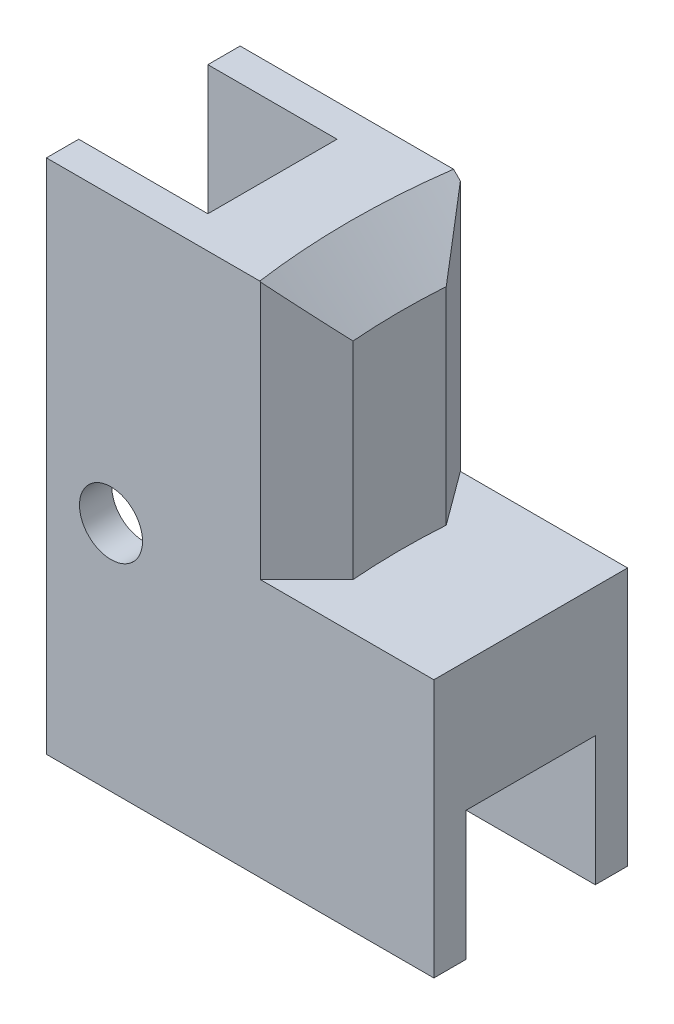
ISO-10303-21;
HEADER;
FILE_DESCRIPTION(('STEP AP214'),'2;1');
FILE_NAME('part.step','',(''),(''),'','','');
FILE_SCHEMA(('AUTOMOTIVE_DESIGN { 1 0 10303 214 1 1 1 1 }'));
ENDSEC;
DATA;
#1=APPLICATION_CONTEXT('core data for automotive mechanical design processes');
#2=APPLICATION_PROTOCOL_DEFINITION('international standard','automotive_design',2000,#1);
#3=PRODUCT_CONTEXT('',#1,'mechanical');
#4=PRODUCT('Part','Part','',(#3));
#5=PRODUCT_RELATED_PRODUCT_CATEGORY('part','',(#4));
#6=PRODUCT_DEFINITION_FORMATION('','',#4);
#7=PRODUCT_DEFINITION_CONTEXT('part definition',#1,'design');
#8=PRODUCT_DEFINITION('design','',#6,#7);
#9=PRODUCT_DEFINITION_SHAPE('','',#8);
#10=(LENGTH_UNIT() NAMED_UNIT(*) SI_UNIT(.MILLI.,.METRE.));
#11=(NAMED_UNIT(*) PLANE_ANGLE_UNIT() SI_UNIT($,.RADIAN.));
#12=(NAMED_UNIT(*) SI_UNIT($,.STERADIAN.) SOLID_ANGLE_UNIT());
#13=UNCERTAINTY_MEASURE_WITH_UNIT(LENGTH_MEASURE(1.E-05),#10,'distance_accuracy_value','');
#14=(GEOMETRIC_REPRESENTATION_CONTEXT(3) GLOBAL_UNCERTAINTY_ASSIGNED_CONTEXT((#13)) GLOBAL_UNIT_ASSIGNED_CONTEXT((#10,
#11,#12)) REPRESENTATION_CONTEXT('',''));
#15=CARTESIAN_POINT('',(0.,0.,0.));
#16=DIRECTION('',(0.,0.,1.));
#17=DIRECTION('',(1.,0.,0.));
#18=AXIS2_PLACEMENT_3D('',#15,#16,#17);
#19=CARTESIAN_POINT('',(-44.45,19.05,4.7625));
#20=DIRECTION('',(1.,0.,0.));
#21=DIRECTION('',(0.,0.,-1.));
#22=AXIS2_PLACEMENT_3D('',#19,#20,#21);
#23=PLANE('',#22);
#24=DIRECTION('',(0.,-1.,0.));
#25=VECTOR('',#24,1.);
#26=CARTESIAN_POINT('',(-44.45,-6.35,3.175));
#27=LINE('',#26,#25);
#28=CARTESIAN_POINT('',(-44.45,19.05,3.175));
#29=VERTEX_POINT('',#28);
#30=CARTESIAN_POINT('',(-44.45,-6.35,3.175));
#31=VERTEX_POINT('',#30);
#32=EDGE_CURVE('E242',#29,#31,#27,.T.);
#33=ORIENTED_EDGE('',*,*,#32,.T.);
#34=DIRECTION('',(0.,0.,-1.));
#35=VECTOR('',#34,1.);
#36=CARTESIAN_POINT('',(-44.45,-6.35,4.7625));
#37=LINE('',#36,#35);
#38=CARTESIAN_POINT('',(-44.45,-6.35,4.7625));
#39=VERTEX_POINT('',#38);
#40=EDGE_CURVE('E175',#39,#31,#37,.T.);
#41=ORIENTED_EDGE('',*,*,#40,.F.);
#42=DIRECTION('',(0.,-1.,0.));
#43=VECTOR('',#42,1.);
#44=CARTESIAN_POINT('',(-44.45,19.05,4.7625));
#45=LINE('',#44,#43);
#46=CARTESIAN_POINT('',(-44.45,19.05,4.7625));
#47=VERTEX_POINT('',#46);
#48=EDGE_CURVE('E291',#47,#39,#45,.T.);
#49=ORIENTED_EDGE('',*,*,#48,.F.);
#50=DIRECTION('',(0.,0.,-1.));
#51=VECTOR('',#50,1.);
#52=CARTESIAN_POINT('',(-44.45,19.05,4.7625));
#53=LINE('',#52,#51);
#54=EDGE_CURVE('E184',#47,#29,#53,.T.);
#55=ORIENTED_EDGE('',*,*,#54,.T.);
#56=EDGE_LOOP('',(#33,#41,#49,#55));
#57=FACE_BOUND('',#56,.T.);
#58=ADVANCED_FACE('F32',(#57),#23,.F.);
#59=CARTESIAN_POINT('',(-44.45,-6.35,4.7625));
#60=DIRECTION('',(0.,1.,0.));
#61=DIRECTION('',(-1.,0.,0.));
#62=AXIS2_PLACEMENT_3D('',#59,#60,#61);
#63=PLANE('',#62);
#64=DIRECTION('',(1.,0.,0.));
#65=VECTOR('',#64,1.);
#66=CARTESIAN_POINT('',(-25.4,-6.35,3.175));
#67=LINE('',#66,#65);
#68=CARTESIAN_POINT('',(-25.4,-6.35,3.175));
#69=VERTEX_POINT('',#68);
#70=EDGE_CURVE('E270',#31,#69,#67,.T.);
#71=ORIENTED_EDGE('',*,*,#70,.T.);
#72=DIRECTION('',(0.,0.,-1.));
#73=VECTOR('',#72,1.);
#74=CARTESIAN_POINT('',(-25.4,-6.35,4.7625));
#75=LINE('',#74,#73);
#76=CARTESIAN_POINT('',(-25.4,-6.35,4.7625));
#77=VERTEX_POINT('',#76);
#78=EDGE_CURVE('E176',#77,#69,#75,.T.);
#79=ORIENTED_EDGE('',*,*,#78,.F.);
#80=DIRECTION('',(1.,0.,0.));
#81=VECTOR('',#80,1.);
#82=CARTESIAN_POINT('',(-44.45,-6.35,4.7625));
#83=LINE('',#82,#81);
#84=EDGE_CURVE('E293',#39,#77,#83,.T.);
#85=ORIENTED_EDGE('',*,*,#84,.F.);
#86=ORIENTED_EDGE('',*,*,#40,.T.);
#87=EDGE_LOOP('',(#71,#79,#85,#86));
#88=FACE_BOUND('',#87,.T.);
#89=ADVANCED_FACE('F340',(#88),#63,.F.);
#90=CARTESIAN_POINT('',(-28.575,19.05,4.7625));
#91=DIRECTION('',(0.,-1.,0.));
#92=DIRECTION('',(1.,0.,0.));
#93=AXIS2_PLACEMENT_3D('',#90,#91,#92);
#94=PLANE('',#93);
#95=DIRECTION('',(-1.,0.,0.));
#96=VECTOR('',#95,1.);
#97=CARTESIAN_POINT('',(-28.575,19.05,4.7625));
#98=LINE('',#97,#96);
#99=CARTESIAN_POINT('',(-33.9576603103041,19.05,4.7625));
#100=VERTEX_POINT('',#99);
#101=EDGE_CURVE('E289',#100,#47,#98,.T.);
#102=ORIENTED_EDGE('',*,*,#101,.F.);
#103=CARTESIAN_POINT('',(0.,19.05,0.));
#104=DIRECTION('',(0.,-1.,0.));
#105=DIRECTION('',(1.,0.,0.));
#106=AXIS2_PLACEMENT_3D('',#103,#104,#105);
#107=CIRCLE('',#106,34.2900000000001);
#108=CARTESIAN_POINT('',(-33.9576603103041,19.05,-4.7625));
#109=VERTEX_POINT('',#108);
#110=EDGE_CURVE('E316',#100,#109,#107,.T.);
#111=ORIENTED_EDGE('',*,*,#110,.T.);
#112=DIRECTION('',(-1.,0.,0.));
#113=VECTOR('',#112,1.);
#114=CARTESIAN_POINT('',(-28.575,19.05,-4.7625));
#115=LINE('',#114,#113);
#116=CARTESIAN_POINT('',(-44.45,19.05,-4.7625));
#117=VERTEX_POINT('',#116);
#118=EDGE_CURVE('E286',#109,#117,#115,.T.);
#119=ORIENTED_EDGE('',*,*,#118,.T.);
#120=CARTESIAN_POINT('',(-44.45,19.05,-3.175));
#121=VERTEX_POINT('',#120);
#122=EDGE_CURVE('E179',#121,#117,#53,.T.);
#123=ORIENTED_EDGE('',*,*,#122,.F.);
#124=DIRECTION('',(-1.,0.,0.));
#125=VECTOR('',#124,1.);
#126=CARTESIAN_POINT('',(-44.45,19.05,-3.175));
#127=LINE('',#126,#125);
#128=CARTESIAN_POINT('',(-38.1,19.05,-3.175));
#129=VERTEX_POINT('',#128);
#130=EDGE_CURVE('E155',#129,#121,#127,.T.);
#131=ORIENTED_EDGE('',*,*,#130,.F.);
#132=DIRECTION('',(0.,0.,1.));
#133=VECTOR('',#132,1.);
#134=CARTESIAN_POINT('',(-38.1,19.05,-3.175));
#135=LINE('',#134,#133);
#136=CARTESIAN_POINT('',(-38.1,19.05,3.175));
#137=VERTEX_POINT('',#136);
#138=EDGE_CURVE('E283',#129,#137,#135,.T.);
#139=ORIENTED_EDGE('',*,*,#138,.T.);
#140=DIRECTION('',(-1.,0.,0.));
#141=VECTOR('',#140,1.);
#142=CARTESIAN_POINT('',(-44.45,19.05,3.175));
#143=LINE('',#142,#141);
#144=EDGE_CURVE('E160',#137,#29,#143,.T.);
#145=ORIENTED_EDGE('',*,*,#144,.T.);
#146=ORIENTED_EDGE('',*,*,#54,.F.);
#147=EDGE_LOOP('',(#102,#111,#119,#123,#131,#139,#145,#146));
#148=FACE_BOUND('',#147,.T.);
#149=ADVANCED_FACE('F342',(#148),#94,.F.);
#150=CARTESIAN_POINT('',(-44.45,-6.35,-3.175));
#151=VERTEX_POINT('',#150);
#152=CARTESIAN_POINT('',(-44.45,-6.35,-4.7625));
#153=VERTEX_POINT('',#152);
#154=EDGE_CURVE('E166',#151,#153,#37,.T.);
#155=ORIENTED_EDGE('',*,*,#154,.F.);
#156=DIRECTION('',(0.,-1.,0.));
#157=VECTOR('',#156,1.);
#158=CARTESIAN_POINT('',(-44.45,-6.35,-3.175));
#159=LINE('',#158,#157);
#160=EDGE_CURVE('E148',#121,#151,#159,.T.);
#161=ORIENTED_EDGE('',*,*,#160,.F.);
#162=ORIENTED_EDGE('',*,*,#122,.T.);
#163=DIRECTION('',(0.,-1.,0.));
#164=VECTOR('',#163,1.);
#165=CARTESIAN_POINT('',(-44.45,19.05,-4.7625));
#166=LINE('',#165,#164);
#167=EDGE_CURVE('E173',#117,#153,#166,.T.);
#168=ORIENTED_EDGE('',*,*,#167,.T.);
#169=EDGE_LOOP('',(#155,#161,#162,#168));
#170=FACE_BOUND('',#169,.T.);
#171=ADVANCED_FACE('F171',(#170),#23,.F.);
#172=CARTESIAN_POINT('',(-25.4,-6.35,-3.175));
#173=VERTEX_POINT('',#172);
#174=CARTESIAN_POINT('',(-25.4,-6.35,-4.7625));
#175=VERTEX_POINT('',#174);
#176=EDGE_CURVE('E168',#173,#175,#75,.T.);
#177=ORIENTED_EDGE('',*,*,#176,.F.);
#178=DIRECTION('',(1.,0.,0.));
#179=VECTOR('',#178,1.);
#180=CARTESIAN_POINT('',(-25.4,-6.35,-3.175));
#181=LINE('',#180,#179);
#182=EDGE_CURVE('E152',#151,#173,#181,.T.);
#183=ORIENTED_EDGE('',*,*,#182,.F.);
#184=ORIENTED_EDGE('',*,*,#154,.T.);
#185=DIRECTION('',(1.,0.,0.));
#186=VECTOR('',#185,1.);
#187=CARTESIAN_POINT('',(-44.45,-6.35,-4.7625));
#188=LINE('',#187,#186);
#189=EDGE_CURVE('E302',#153,#175,#188,.T.);
#190=ORIENTED_EDGE('',*,*,#189,.T.);
#191=EDGE_LOOP('',(#177,#183,#184,#190));
#192=FACE_BOUND('',#191,.T.);
#193=ADVANCED_FACE('F164',(#192),#63,.F.);
#194=CARTESIAN_POINT('',(-25.4,-6.35,4.7625));
#195=DIRECTION('',(-1.,0.,0.));
#196=DIRECTION('',(0.,-1.,0.));
#197=AXIS2_PLACEMENT_3D('',#194,#195,#196);
#198=PLANE('',#197);
#199=DIRECTION('',(0.,0.,1.));
#200=VECTOR('',#199,1.);
#201=CARTESIAN_POINT('',(-25.4,0.,-3.175));
#202=LINE('',#201,#200);
#203=CARTESIAN_POINT('',(-25.4,0.,-3.175));
#204=VERTEX_POINT('',#203);
#205=CARTESIAN_POINT('',(-25.4,0.,3.175));
#206=VERTEX_POINT('',#205);
#207=EDGE_CURVE('E267',#204,#206,#202,.T.);
#208=ORIENTED_EDGE('',*,*,#207,.F.);
#209=DIRECTION('',(0.,1.,0.));
#210=VECTOR('',#209,1.);
#211=CARTESIAN_POINT('',(-25.4,0.,-3.175));
#212=LINE('',#211,#210);
#213=EDGE_CURVE('E169',#173,#204,#212,.T.);
#214=ORIENTED_EDGE('',*,*,#213,.F.);
#215=ORIENTED_EDGE('',*,*,#176,.T.);
#216=DIRECTION('',(0.,1.,0.));
#217=VECTOR('',#216,1.);
#218=CARTESIAN_POINT('',(-25.4,-6.35,-4.7625));
#219=LINE('',#218,#217);
#220=CARTESIAN_POINT('',(-25.4,6.35,-4.7625));
#221=VERTEX_POINT('',#220);
#222=EDGE_CURVE('E304',#175,#221,#219,.T.);
#223=ORIENTED_EDGE('',*,*,#222,.T.);
#224=DIRECTION('',(0.,0.,-1.));
#225=VECTOR('',#224,1.);
#226=CARTESIAN_POINT('',(-25.4,6.35,4.7625));
#227=LINE('',#226,#225);
#228=CARTESIAN_POINT('',(-25.4,6.35,4.7625));
#229=VERTEX_POINT('',#228);
#230=EDGE_CURVE('E299',#229,#221,#227,.T.);
#231=ORIENTED_EDGE('',*,*,#230,.F.);
#232=DIRECTION('',(0.,1.,0.));
#233=VECTOR('',#232,1.);
#234=CARTESIAN_POINT('',(-25.4,-6.35,4.7625));
#235=LINE('',#234,#233);
#236=EDGE_CURVE('E295',#77,#229,#235,.T.);
#237=ORIENTED_EDGE('',*,*,#236,.F.);
#238=ORIENTED_EDGE('',*,*,#78,.T.);
#239=DIRECTION('',(0.,1.,0.));
#240=VECTOR('',#239,1.);
#241=CARTESIAN_POINT('',(-25.4,0.,3.175));
#242=LINE('',#241,#240);
#243=EDGE_CURVE('E273',#69,#206,#242,.T.);
#244=ORIENTED_EDGE('',*,*,#243,.T.);
#245=EDGE_LOOP('',(#208,#214,#215,#223,#231,#237,#238,#244));
#246=FACE_BOUND('',#245,.T.);
#247=ADVANCED_FACE('F310',(#246),#198,.F.);
#248=CARTESIAN_POINT('',(-25.4,6.35,4.7625));
#249=DIRECTION('',(0.,-1.,0.));
#250=DIRECTION('',(0.,0.,-1.));
#251=AXIS2_PLACEMENT_3D('',#248,#249,#250);
#252=PLANE('',#251);
#253=DIRECTION('',(-1.,0.,0.));
#254=VECTOR('',#253,1.);
#255=CARTESIAN_POINT('',(-25.4,6.35,-4.7625));
#256=LINE('',#255,#254);
#257=CARTESIAN_POINT('',(-33.6214216836475,6.35,-4.7625));
#258=VERTEX_POINT('',#257);
#259=EDGE_CURVE('E49',#221,#258,#256,.T.);
#260=ORIENTED_EDGE('',*,*,#259,.T.);
#261=DIRECTION('',(0.593040555527492,0.,0.805172589883463));
#262=VECTOR('',#261,1.);
#263=CARTESIAN_POINT('',(-26.181784015518,6.35,5.33831397167578));
#264=LINE('',#263,#262);
#265=CARTESIAN_POINT('',(-31.678807444753,6.34999999999999,-2.12500797134108));
#266=VERTEX_POINT('',#265);
#267=EDGE_CURVE('E11',#258,#266,#264,.T.);
#268=ORIENTED_EDGE('',*,*,#267,.T.);
#269=CARTESIAN_POINT('',(0.,6.34999999999999,0.));
#270=DIRECTION('',(0.,-1.,0.));
#271=DIRECTION('',(0.,0.,-1.));
#272=AXIS2_PLACEMENT_3D('',#269,#270,#271);
#273=CIRCLE('',#272,31.75);
#274=CARTESIAN_POINT('',(-31.6526522796179,6.34999999999999,2.48437188552766));
#275=VERTEX_POINT('',#274);
#276=EDGE_CURVE('E238',#266,#275,#273,.F.);
#277=ORIENTED_EDGE('',*,*,#276,.T.);
#278=DIRECTION('',(-0.707106781186549,0.,0.707106781186547));
#279=VECTOR('',#278,1.);
#280=CARTESIAN_POINT('',(-29.6653901970451,6.35,0.497109802954887));
#281=LINE('',#280,#279);
#282=CARTESIAN_POINT('',(-33.9307803940902,6.35,4.7625));
#283=VERTEX_POINT('',#282);
#284=EDGE_CURVE('E42',#275,#283,#281,.T.);
#285=ORIENTED_EDGE('',*,*,#284,.T.);
#286=DIRECTION('',(-1.,0.,0.));
#287=VECTOR('',#286,1.);
#288=CARTESIAN_POINT('',(-25.4,6.35,4.7625));
#289=LINE('',#288,#287);
#290=EDGE_CURVE('E297',#229,#283,#289,.T.);
#291=ORIENTED_EDGE('',*,*,#290,.F.);
#292=ORIENTED_EDGE('',*,*,#230,.T.);
#293=EDGE_LOOP('',(#260,#268,#277,#285,#291,#292));
#294=FACE_BOUND('',#293,.T.);
#295=ADVANCED_FACE('F320',(#294),#252,.F.);
#296=CARTESIAN_POINT('',(0.,0.,4.7625));
#297=DIRECTION('',(0.,0.,1.));
#298=DIRECTION('',(1.,0.,0.));
#299=AXIS2_PLACEMENT_3D('',#296,#297,#298);
#300=PLANE('',#299);
#301=CARTESIAN_POINT('',(-41.275,5.08,4.7625));
#302=DIRECTION('',(0.,0.,1.));
#303=DIRECTION('',(1.,0.,0.));
#304=AXIS2_PLACEMENT_3D('',#301,#302,#303);
#305=CIRCLE('',#304,1.55);
#306=CARTESIAN_POINT('',(-39.725,5.08,4.7625));
#307=VERTEX_POINT('',#306);
#308=EDGE_CURVE('E257',#307,#307,#305,.T.);
#309=ORIENTED_EDGE('',*,*,#308,.F.);
#310=EDGE_LOOP('',(#309));
#311=FACE_BOUND('',#310,.T.);
#312=ORIENTED_EDGE('',*,*,#290,.T.);
#313=DIRECTION('',(0.,1.,0.));
#314=VECTOR('',#313,1.);
#315=CARTESIAN_POINT('',(-33.9307803940902,19.05,4.7625));
#316=LINE('',#315,#314);
#317=CARTESIAN_POINT('',(-33.9307803940902,19.023380808116,4.7625));
#318=VERTEX_POINT('',#317);
#319=EDGE_CURVE('E210',#283,#318,#316,.T.);
#320=ORIENTED_EDGE('',*,*,#319,.T.);
#321=CARTESIAN_POINT('',(-33.9307803940902,19.023380808116,4.7625));
#322=CARTESIAN_POINT('',(-33.9352603970809,19.0278173229756,4.7625));
#323=CARTESIAN_POINT('',(-33.939740391594,19.0322538463958,4.7625));
#324=CARTESIAN_POINT('',(-33.9487003636653,19.0411269103571,4.7625));
#325=CARTESIAN_POINT('',(-33.9531803412235,19.0455634508983,4.7625));
#326=CARTESIAN_POINT('',(-33.9576603103041,19.05,4.7625));
#327=B_SPLINE_CURVE_WITH_KNOTS('',3,(#321,#322,#323,#324,#325,#326),.UNSPECIFIED.,.F.,.F.,(4,2,
4),(0.,0.0189150156768828,0.0378300313537609),.UNSPECIFIED.);
#328=EDGE_CURVE('E203',#318,#100,#327,.T.);
#329=ORIENTED_EDGE('',*,*,#328,.T.);
#330=ORIENTED_EDGE('',*,*,#101,.T.);
#331=ORIENTED_EDGE('',*,*,#48,.T.);
#332=ORIENTED_EDGE('',*,*,#84,.T.);
#333=ORIENTED_EDGE('',*,*,#236,.T.);
#334=EDGE_LOOP('',(#312,#320,#329,#330,#331,#332,#333));
#335=FACE_BOUND('',#334,.T.);
#336=ADVANCED_FACE('F212',(#311,#335),#300,.T.);
#337=CARTESIAN_POINT('',(0.,0.,-4.7625));
#338=DIRECTION('',(0.,0.,1.));
#339=DIRECTION('',(1.,0.,0.));
#340=AXIS2_PLACEMENT_3D('',#337,#338,#339);
#341=PLANE('',#340);
#342=CARTESIAN_POINT('',(-41.275,5.08,-4.7625));
#343=DIRECTION('',(0.,0.,1.));
#344=DIRECTION('',(1.,0.,0.));
#345=AXIS2_PLACEMENT_3D('',#342,#343,#344);
#346=CIRCLE('',#345,1.55);
#347=CARTESIAN_POINT('',(-39.725,5.08,-4.7625));
#348=VERTEX_POINT('',#347);
#349=EDGE_CURVE('E255',#348,#348,#346,.T.);
#350=ORIENTED_EDGE('',*,*,#349,.T.);
#351=EDGE_LOOP('',(#350));
#352=FACE_BOUND('',#351,.T.);
#353=DIRECTION('',(0.,-1.,0.));
#354=VECTOR('',#353,1.);
#355=CARTESIAN_POINT('',(-33.6214216836475,0.,-4.7625));
#356=LINE('',#355,#354);
#357=CARTESIAN_POINT('',(-33.6214216836475,18.7170523202418,-4.7625));
#358=VERTEX_POINT('',#357);
#359=EDGE_CURVE('E313',#358,#258,#356,.T.);
#360=ORIENTED_EDGE('',*,*,#359,.T.);
#361=ORIENTED_EDGE('',*,*,#259,.F.);
#362=ORIENTED_EDGE('',*,*,#222,.F.);
#363=ORIENTED_EDGE('',*,*,#189,.F.);
#364=ORIENTED_EDGE('',*,*,#167,.F.);
#365=ORIENTED_EDGE('',*,*,#118,.F.);
#366=CARTESIAN_POINT('',(-33.9576603103041,19.05,-4.7625));
#367=CARTESIAN_POINT('',(-33.9016232281389,18.9945060045181,-4.7625));
#368=CARTESIAN_POINT('',(-33.8455848015017,18.9390133667974,-4.7625));
#369=CARTESIAN_POINT('',(-33.7335052592828,18.828030806878,-4.7625));
#370=CARTESIAN_POINT('',(-33.6774641437012,18.7725408846793,-4.7625));
#371=CARTESIAN_POINT('',(-33.6214216836475,18.7170523202418,-4.7625));
#372=B_SPLINE_CURVE_WITH_KNOTS('',3,(#366,#367,#368,#369,#370,#371),.UNSPECIFIED.,.F.,.F.,(4,2,
4),(0.,0.23659594863524,0.473191897271836),.UNSPECIFIED.);
#373=EDGE_CURVE('E56',#109,#358,#372,.T.);
#374=ORIENTED_EDGE('',*,*,#373,.T.);
#375=EDGE_LOOP('',(#360,#361,#362,#363,#364,#365,#374));
#376=FACE_BOUND('',#375,.T.);
#377=ADVANCED_FACE('F312',(#352,#376),#341,.F.);
#378=CARTESIAN_POINT('',(-38.1,19.05,-3.175));
#379=DIRECTION('',(1.,0.,0.));
#380=DIRECTION('',(0.,0.,-1.));
#381=AXIS2_PLACEMENT_3D('',#378,#379,#380);
#382=PLANE('',#381);
#383=DIRECTION('',(0.,1.,0.));
#384=VECTOR('',#383,1.);
#385=CARTESIAN_POINT('',(-38.1,19.05,-3.175));
#386=LINE('',#385,#384);
#387=CARTESIAN_POINT('',(-38.1,3.30200000000001,-3.175));
#388=VERTEX_POINT('',#387);
#389=EDGE_CURVE('E264',#388,#129,#386,.T.);
#390=ORIENTED_EDGE('',*,*,#389,.F.);
#391=DIRECTION('',(0.,0.,1.));
#392=VECTOR('',#391,1.);
#393=CARTESIAN_POINT('',(-38.1,3.302,-3.175));
#394=LINE('',#393,#392);
#395=CARTESIAN_POINT('',(-38.1,3.30200000000001,3.175));
#396=VERTEX_POINT('',#395);
#397=EDGE_CURVE('E187',#388,#396,#394,.T.);
#398=ORIENTED_EDGE('',*,*,#397,.T.);
#399=DIRECTION('',(0.,1.,0.));
#400=VECTOR('',#399,1.);
#401=CARTESIAN_POINT('',(-38.1,19.05,3.175));
#402=LINE('',#401,#400);
#403=EDGE_CURVE('E279',#396,#137,#402,.T.);
#404=ORIENTED_EDGE('',*,*,#403,.T.);
#405=ORIENTED_EDGE('',*,*,#138,.F.);
#406=EDGE_LOOP('',(#390,#398,#404,#405));
#407=FACE_BOUND('',#406,.T.);
#408=ADVANCED_FACE('F332',(#407),#382,.F.);
#409=CARTESIAN_POINT('',(-38.1,0.,-3.175));
#410=DIRECTION('',(0.,1.,0.));
#411=DIRECTION('',(-1.,0.,0.));
#412=AXIS2_PLACEMENT_3D('',#409,#410,#411);
#413=PLANE('',#412);
#414=DIRECTION('',(-1.,0.,0.));
#415=VECTOR('',#414,1.);
#416=CARTESIAN_POINT('',(-38.1,0.,3.175));
#417=LINE('',#416,#415);
#418=CARTESIAN_POINT('',(-34.798,0.,3.175));
#419=VERTEX_POINT('',#418);
#420=EDGE_CURVE('E276',#206,#419,#417,.T.);
#421=ORIENTED_EDGE('',*,*,#420,.T.);
#422=DIRECTION('',(0.,0.,1.));
#423=VECTOR('',#422,1.);
#424=CARTESIAN_POINT('',(-34.798,0.,-3.175));
#425=LINE('',#424,#423);
#426=CARTESIAN_POINT('',(-34.798,0.,-3.175));
#427=VERTEX_POINT('',#426);
#428=EDGE_CURVE('E190',#419,#427,#425,.F.);
#429=ORIENTED_EDGE('',*,*,#428,.T.);
#430=DIRECTION('',(-1.,0.,0.));
#431=VECTOR('',#430,1.);
#432=CARTESIAN_POINT('',(-38.1,0.,-3.175));
#433=LINE('',#432,#431);
#434=EDGE_CURVE('E261',#204,#427,#433,.T.);
#435=ORIENTED_EDGE('',*,*,#434,.F.);
#436=ORIENTED_EDGE('',*,*,#207,.T.);
#437=EDGE_LOOP('',(#421,#429,#435,#436));
#438=FACE_BOUND('',#437,.T.);
#439=ADVANCED_FACE('F374',(#438),#413,.F.);
#440=CARTESIAN_POINT('',(0.,0.,-3.175));
#441=DIRECTION('',(0.,0.,-1.));
#442=DIRECTION('',(-1.,0.,0.));
#443=AXIS2_PLACEMENT_3D('',#440,#441,#442);
#444=PLANE('',#443);
#445=CARTESIAN_POINT('',(-41.275,5.08,-3.175));
#446=DIRECTION('',(0.,0.,-1.));
#447=DIRECTION('',(-1.,0.,0.));
#448=AXIS2_PLACEMENT_3D('',#445,#446,#447);
#449=CIRCLE('',#448,1.55);
#450=CARTESIAN_POINT('',(-39.725,5.08,-3.175));
#451=VERTEX_POINT('',#450);
#452=EDGE_CURVE('E245',#451,#451,#449,.T.);
#453=ORIENTED_EDGE('',*,*,#452,.T.);
#454=EDGE_LOOP('',(#453));
#455=FACE_BOUND('',#454,.T.);
#456=ORIENTED_EDGE('',*,*,#160,.T.);
#457=ORIENTED_EDGE('',*,*,#182,.T.);
#458=ORIENTED_EDGE('',*,*,#213,.T.);
#459=ORIENTED_EDGE('',*,*,#434,.T.);
#460=CARTESIAN_POINT('',(-34.798,3.302,-3.175));
#461=DIRECTION('',(0.,0.,-1.));
#462=DIRECTION('',(-1.,0.,0.));
#463=AXIS2_PLACEMENT_3D('',#460,#461,#462);
#464=CIRCLE('',#463,3.302);
#465=EDGE_CURVE('E194',#427,#388,#464,.T.);
#466=ORIENTED_EDGE('',*,*,#465,.T.);
#467=ORIENTED_EDGE('',*,*,#389,.T.);
#468=ORIENTED_EDGE('',*,*,#130,.T.);
#469=EDGE_LOOP('',(#456,#457,#458,#459,#466,#467,#468));
#470=FACE_BOUND('',#469,.T.);
#471=ADVANCED_FACE('F150',(#455,#470),#444,.F.);
#472=CARTESIAN_POINT('',(0.,0.,3.175));
#473=DIRECTION('',(0.,0.,-1.));
#474=DIRECTION('',(-1.,0.,0.));
#475=AXIS2_PLACEMENT_3D('',#472,#473,#474);
#476=PLANE('',#475);
#477=CARTESIAN_POINT('',(-41.275,5.08,3.175));
#478=DIRECTION('',(0.,0.,-1.));
#479=DIRECTION('',(-1.,0.,0.));
#480=AXIS2_PLACEMENT_3D('',#477,#478,#479);
#481=CIRCLE('',#480,1.55);
#482=CARTESIAN_POINT('',(-39.725,5.08,3.175));
#483=VERTEX_POINT('',#482);
#484=EDGE_CURVE('E37',#483,#483,#481,.T.);
#485=ORIENTED_EDGE('',*,*,#484,.F.);
#486=EDGE_LOOP('',(#485));
#487=FACE_BOUND('',#486,.T.);
#488=ORIENTED_EDGE('',*,*,#32,.F.);
#489=ORIENTED_EDGE('',*,*,#144,.F.);
#490=ORIENTED_EDGE('',*,*,#403,.F.);
#491=CARTESIAN_POINT('',(-34.798,3.302,3.175));
#492=DIRECTION('',(0.,0.,-1.));
#493=DIRECTION('',(-1.,0.,0.));
#494=AXIS2_PLACEMENT_3D('',#491,#492,#493);
#495=CIRCLE('',#494,3.302);
#496=EDGE_CURVE('E192',#396,#419,#495,.F.);
#497=ORIENTED_EDGE('',*,*,#496,.T.);
#498=ORIENTED_EDGE('',*,*,#420,.F.);
#499=ORIENTED_EDGE('',*,*,#243,.F.);
#500=ORIENTED_EDGE('',*,*,#70,.F.);
#501=EDGE_LOOP('',(#488,#489,#490,#497,#498,#499,#500));
#502=FACE_BOUND('',#501,.T.);
#503=ADVANCED_FACE('F366',(#487,#502),#476,.T.);
#504=CARTESIAN_POINT('',(-34.798,3.302,-3.175));
#505=DIRECTION('',(0.,0.,1.));
#506=DIRECTION('',(1.,0.,0.));
#507=AXIS2_PLACEMENT_3D('',#504,#505,#506);
#508=CYLINDRICAL_SURFACE('',#507,3.302);
#509=ORIENTED_EDGE('',*,*,#465,.F.);
#510=ORIENTED_EDGE('',*,*,#428,.F.);
#511=ORIENTED_EDGE('',*,*,#496,.F.);
#512=ORIENTED_EDGE('',*,*,#397,.F.);
#513=EDGE_LOOP('',(#509,#510,#511,#512));
#514=FACE_BOUND('',#513,.T.);
#515=ADVANCED_FACE('F222',(#514),#508,.T.);
#516=CARTESIAN_POINT('',(0.,-83.4525612106915,0.));
#517=DIRECTION('',(0.,1.,0.));
#518=DIRECTION('',(-1.,0.,0.));
#519=AXIS2_PLACEMENT_3D('',#516,#517,#518);
#520=CYLINDRICAL_SURFACE('',#519,31.75);
#521=CARTESIAN_POINT('',(0.,16.51,0.));
#522=DIRECTION('',(0.,-1.,0.));
#523=DIRECTION('',(1.,0.,0.));
#524=AXIS2_PLACEMENT_3D('',#521,#522,#523);
#525=CIRCLE('',#524,31.75);
#526=CARTESIAN_POINT('',(-31.678807444753,16.51,-2.12500797134108));
#527=VERTEX_POINT('',#526);
#528=CARTESIAN_POINT('',(-31.6526522796179,16.51,2.48437188552766));
#529=VERTEX_POINT('',#528);
#530=EDGE_CURVE('E196',#527,#529,#525,.F.);
#531=ORIENTED_EDGE('',*,*,#530,.T.);
#532=DIRECTION('',(0.,1.,0.));
#533=VECTOR('',#532,1.);
#534=CARTESIAN_POINT('',(-31.6526522796179,-83.4525612106915,2.48437188552766));
#535=LINE('',#534,#533);
#536=EDGE_CURVE('E200',#529,#275,#535,.F.);
#537=ORIENTED_EDGE('',*,*,#536,.T.);
#538=ORIENTED_EDGE('',*,*,#276,.F.);
#539=DIRECTION('',(0.,1.,0.));
#540=VECTOR('',#539,1.);
#541=CARTESIAN_POINT('',(-31.678807444753,-83.4525612106915,-2.12500797134108));
#542=LINE('',#541,#540);
#543=EDGE_CURVE('E198',#266,#527,#542,.T.);
#544=ORIENTED_EDGE('',*,*,#543,.T.);
#545=EDGE_LOOP('',(#531,#537,#538,#544));
#546=FACE_BOUND('',#545,.T.);
#547=ADVANCED_FACE('F323',(#546),#520,.F.);
#548=CARTESIAN_POINT('',(-33.6214216836475,-83.4525612106915,-4.7625));
#549=DIRECTION('',(0.805172589883463,0.,-0.593040555527492));
#550=DIRECTION('',(0.,1.,0.));
#551=AXIS2_PLACEMENT_3D('',#548,#549,#550);
#552=PLANE('',#551);
#553=ORIENTED_EDGE('',*,*,#267,.F.);
#554=ORIENTED_EDGE('',*,*,#359,.F.);
#555=CARTESIAN_POINT('',(-31.678807444753,16.51,-2.12500797134108));
#556=CARTESIAN_POINT('',(-31.8428186118604,16.6885510754049,-2.3476863277517));
#557=CARTESIAN_POINT('',(-32.0062611981724,16.8685826509612,-2.5695927206476));
#558=CARTESIAN_POINT('',(-32.3320537541385,17.2313838871709,-3.01192205817262));
#559=CARTESIAN_POINT('',(-32.4944038183681,17.414153306283,-3.23234513120721));
#560=CARTESIAN_POINT('',(-32.8180831801691,17.7822370651009,-3.67180537992719));
#561=CARTESIAN_POINT('',(-32.9794124868414,17.96755138207,-3.89084256796888));
#562=CARTESIAN_POINT('',(-33.3011202682093,18.3405631877581,-4.32762599718856));
#563=CARTESIAN_POINT('',(-33.4614986582718,18.5282608840662,-4.54537212346003));
#564=CARTESIAN_POINT('',(-33.6214216836475,18.7170523202418,-4.7625));
#565=B_SPLINE_CURVE_WITH_KNOTS('',3,(#555,#556,#557,#558,#559,#560,#561,#562,#563,#564),
.UNSPECIFIED.,.F.,.F.,(4,2,2,2,4),(0.,0.987560572830618,1.97503452715912,2.96249966490267,
3.9500514076395),.UNSPECIFIED.);
#566=EDGE_CURVE('E233',#527,#358,#565,.T.);
#567=ORIENTED_EDGE('',*,*,#566,.F.);
#568=ORIENTED_EDGE('',*,*,#543,.F.);
#569=EDGE_LOOP('',(#553,#554,#567,#568));
#570=FACE_BOUND('',#569,.T.);
#571=ADVANCED_FACE('F34',(#570),#552,.T.);
#572=CARTESIAN_POINT('',(0.,16.51,0.));
#573=DIRECTION('',(0.,1.,0.));
#574=DIRECTION('',(-1.,0.,0.));
#575=AXIS2_PLACEMENT_3D('',#572,#573,#574);
#576=CONICAL_SURFACE('',#575,31.75,0.785398163397452);
#577=ORIENTED_EDGE('',*,*,#110,.F.);
#578=ORIENTED_EDGE('',*,*,#328,.F.);
#579=CARTESIAN_POINT('',(-33.9307803940902,19.023380808116,4.7625));
#580=CARTESIAN_POINT('',(-33.7426197611455,18.8108954006391,4.5743393670553));
#581=CARTESIAN_POINT('',(-33.5540731150106,18.5990924600558,4.38579272092035));
#582=CARTESIAN_POINT('',(-33.1761618915087,18.1769706932847,4.00788149741841));
#583=CARTESIAN_POINT('',(-32.9867973432342,17.9666518149988,3.81851694914397));
#584=CARTESIAN_POINT('',(-32.6071903935126,17.5476015190773,3.43890999942233));
#585=CARTESIAN_POINT('',(-32.4169479886119,17.3388701076952,3.24866759452163));
#586=CARTESIAN_POINT('',(-32.0355203604371,16.9231178255799,2.86723996634688));
#587=CARTESIAN_POINT('',(-31.844335104129,16.7160970154696,2.67605471003877));
#588=CARTESIAN_POINT('',(-31.6526522796179,16.5099999999999,2.48437188552768));
#589=B_SPLINE_CURVE_WITH_KNOTS('',3,(#579,#580,#581,#582,#583,#584,#585,#586,#587,#588),
.UNSPECIFIED.,.F.,.F.,(4,2,2,2,4),(0.,1.02158207285164,2.04312810275649,3.06467815488651,
4.08626425633454),.UNSPECIFIED.);
#590=EDGE_CURVE('E228',#529,#318,#589,.F.);
#591=ORIENTED_EDGE('',*,*,#590,.F.);
#592=ORIENTED_EDGE('',*,*,#530,.F.);
#593=ORIENTED_EDGE('',*,*,#566,.T.);
#594=ORIENTED_EDGE('',*,*,#373,.F.);
#595=EDGE_LOOP('',(#577,#578,#591,#592,#593,#594));
#596=FACE_BOUND('',#595,.T.);
#597=ADVANCED_FACE('F216',(#596),#576,.F.);
#598=CARTESIAN_POINT('',(-31.6526522796179,-83.4525612106915,2.48437188552766));
#599=DIRECTION('',(0.707106781186547,0.,0.707106781186549));
#600=DIRECTION('',(0.,1.,0.));
#601=AXIS2_PLACEMENT_3D('',#598,#599,#600);
#602=PLANE('',#601);
#603=ORIENTED_EDGE('',*,*,#590,.T.);
#604=ORIENTED_EDGE('',*,*,#319,.F.);
#605=ORIENTED_EDGE('',*,*,#284,.F.);
#606=ORIENTED_EDGE('',*,*,#536,.F.);
#607=EDGE_LOOP('',(#603,#604,#605,#606));
#608=FACE_BOUND('',#607,.T.);
#609=ADVANCED_FACE('F220',(#608),#602,.T.);
#610=CARTESIAN_POINT('',(-41.275,5.08,-4.7625));
#611=DIRECTION('',(0.,0.,1.));
#612=DIRECTION('',(1.,0.,0.));
#613=AXIS2_PLACEMENT_3D('',#610,#611,#612);
#614=CYLINDRICAL_SURFACE('',#613,1.55);
#615=CARTESIAN_POINT('',(-39.725,5.08,3.175));
#616=CARTESIAN_POINT('',(-39.725,5.08,3.19153645833334));
#617=CARTESIAN_POINT('',(-39.725,5.08,3.20807291666667));
#618=CARTESIAN_POINT('',(-39.725,5.08,3.24114583333334));
#619=CARTESIAN_POINT('',(-39.725,5.08,3.25768229166667));
#620=CARTESIAN_POINT('',(-39.725,5.08,3.29075520833333));
#621=CARTESIAN_POINT('',(-39.725,5.08,3.30729166666667));
#622=CARTESIAN_POINT('',(-39.725,5.08,3.34036458333333));
#623=CARTESIAN_POINT('',(-39.725,5.08,3.35690104166667));
#624=CARTESIAN_POINT('',(-39.725,5.08,3.38997395833333));
#625=CARTESIAN_POINT('',(-39.725,5.08,3.40651041666667));
#626=CARTESIAN_POINT('',(-39.725,5.08,3.43958333333333));
#627=CARTESIAN_POINT('',(-39.725,5.08,3.45611979166667));
#628=CARTESIAN_POINT('',(-39.725,5.08,3.48919270833333));
#629=CARTESIAN_POINT('',(-39.725,5.08,3.50572916666667));
#630=CARTESIAN_POINT('',(-39.725,5.08,3.53880208333333));
#631=CARTESIAN_POINT('',(-39.725,5.08,3.55533854166667));
#632=CARTESIAN_POINT('',(-39.725,5.08,3.58841145833334));
#633=CARTESIAN_POINT('',(-39.725,5.08,3.60494791666667));
#634=CARTESIAN_POINT('',(-39.725,5.08,3.63802083333333));
#635=CARTESIAN_POINT('',(-39.725,5.08,3.65455729166667));
#636=CARTESIAN_POINT('',(-39.725,5.08,3.68763020833333));
#637=CARTESIAN_POINT('',(-39.725,5.08,3.70416666666667));
#638=CARTESIAN_POINT('',(-39.725,5.08,3.73723958333334));
#639=CARTESIAN_POINT('',(-39.725,5.08,3.75377604166667));
#640=CARTESIAN_POINT('',(-39.725,5.08,3.78684895833333));
#641=CARTESIAN_POINT('',(-39.725,5.08,3.80338541666667));
#642=CARTESIAN_POINT('',(-39.725,5.08,3.83645833333333));
#643=CARTESIAN_POINT('',(-39.725,5.08,3.85299479166667));
#644=CARTESIAN_POINT('',(-39.725,5.08,3.88606770833333));
#645=CARTESIAN_POINT('',(-39.725,5.08,3.90260416666667));
#646=CARTESIAN_POINT('',(-39.725,5.08,3.93567708333333));
#647=CARTESIAN_POINT('',(-39.725,5.08,3.95221354166667));
#648=CARTESIAN_POINT('',(-39.725,5.08,3.98528645833333));
#649=CARTESIAN_POINT('',(-39.725,5.08,4.00182291666667));
#650=CARTESIAN_POINT('',(-39.725,5.08,4.03489583333333));
#651=CARTESIAN_POINT('',(-39.725,5.08,4.05143229166667));
#652=CARTESIAN_POINT('',(-39.725,5.08,4.08450520833333));
#653=CARTESIAN_POINT('',(-39.725,5.08,4.10104166666667));
#654=CARTESIAN_POINT('',(-39.725,5.08,4.13411458333333));
#655=CARTESIAN_POINT('',(-39.725,5.08,4.15065104166667));
#656=CARTESIAN_POINT('',(-39.725,5.08,4.18372395833333));
#657=CARTESIAN_POINT('',(-39.725,5.08,4.20026041666667));
#658=CARTESIAN_POINT('',(-39.725,5.08,4.23333333333333));
#659=CARTESIAN_POINT('',(-39.725,5.08,4.24986979166667));
#660=CARTESIAN_POINT('',(-39.725,5.08,4.28294270833333));
#661=CARTESIAN_POINT('',(-39.725,5.08,4.29947916666667));
#662=CARTESIAN_POINT('',(-39.725,5.08,4.33255208333333));
#663=CARTESIAN_POINT('',(-39.725,5.08,4.34908854166667));
#664=CARTESIAN_POINT('',(-39.725,5.08,4.38216145833333));
#665=CARTESIAN_POINT('',(-39.725,5.08,4.39869791666667));
#666=CARTESIAN_POINT('',(-39.725,5.08,4.43177083333333));
#667=CARTESIAN_POINT('',(-39.725,5.08,4.44830729166667));
#668=CARTESIAN_POINT('',(-39.725,5.08,4.48138020833333));
#669=CARTESIAN_POINT('',(-39.725,5.08,4.49791666666667));
#670=CARTESIAN_POINT('',(-39.725,5.08,4.53098958333333));
#671=CARTESIAN_POINT('',(-39.725,5.08,4.54752604166667));
#672=CARTESIAN_POINT('',(-39.725,5.08,4.58059895833333));
#673=CARTESIAN_POINT('',(-39.725,5.08,4.59713541666667));
#674=CARTESIAN_POINT('',(-39.725,5.08,4.63020833333333));
#675=CARTESIAN_POINT('',(-39.725,5.08,4.64674479166667));
#676=CARTESIAN_POINT('',(-39.725,5.08,4.67981770833333));
#677=CARTESIAN_POINT('',(-39.725,5.08,4.69635416666667));
#678=CARTESIAN_POINT('',(-39.725,5.08,4.72942708333333));
#679=CARTESIAN_POINT('',(-39.725,5.08,4.74596354166667));
#680=CARTESIAN_POINT('',(-39.725,5.08,4.7625));
#681=B_SPLINE_CURVE_WITH_KNOTS('',3,(#615,#616,#617,#618,#619,#620,#621,#622,#623,#624,#625,
#626,#627,#628,#629,#630,#631,#632,#633,#634,#635,#636,#637,#638,#639,#640,#641,#642,#643,#644,
#645,#646,#647,#648,#649,#650,#651,#652,#653,#654,#655,#656,#657,#658,#659,#660,#661,#662,#663,
#664,#665,#666,#667,#668,#669,#670,#671,#672,#673,#674,#675,#676,#677,#678,#679,#680),
.UNSPECIFIED.,.F.,.F.,(4,2,2,2,2,2,2,2,2,2,2,2,2,2,2,2,2,2,2,2,2,2,2,2,2,2,2,2,2,2,2,2,4),(0.,
0.0496093750000006,0.0992187499999995,0.148828125,0.198437499999999,0.248046875,0.29765625,
0.347265624999999,0.396875,0.446484375,0.496093749999999,0.545703125,0.5953125,
0.644921874999999,0.69453125,0.744140624999999,0.793749999999999,0.843359375,0.892968749999999,
0.942578124999999,0.992187499999998,1.041796875,1.09140625,1.141015625,1.190625,1.240234375,
1.28984375,1.339453125,1.3890625,1.438671875,1.48828125,1.537890625,1.5875),.UNSPECIFIED.);
#682=EDGE_CURVE('BSEAM389',#483,#307,#681,.T.);
#683=ORIENTED_EDGE('',*,*,#484,.T.);
#684=ORIENTED_EDGE('',*,*,#308,.T.);
#685=ORIENTED_EDGE('',*,*,#682,.T.);
#686=ORIENTED_EDGE('',*,*,#682,.F.);
#687=EDGE_LOOP('',(#683,#685,#684,#686));
#688=FACE_BOUND('',#687,.T.);
#689=ADVANCED_FACE('F389',(#688),#614,.F.);
#690=CARTESIAN_POINT('',(-39.725,5.08,-4.7625));
#691=CARTESIAN_POINT('',(-39.725,5.08,-4.74596354166667));
#692=CARTESIAN_POINT('',(-39.725,5.08,-4.72942708333333));
#693=CARTESIAN_POINT('',(-39.725,5.08,-4.69635416666667));
#694=CARTESIAN_POINT('',(-39.725,5.08,-4.67981770833333));
#695=CARTESIAN_POINT('',(-39.725,5.08,-4.64674479166667));
#696=CARTESIAN_POINT('',(-39.725,5.08,-4.63020833333333));
#697=CARTESIAN_POINT('',(-39.725,5.08,-4.59713541666667));
#698=CARTESIAN_POINT('',(-39.725,5.08,-4.58059895833333));
#699=CARTESIAN_POINT('',(-39.725,5.08,-4.54752604166667));
#700=CARTESIAN_POINT('',(-39.725,5.08,-4.53098958333333));
#701=CARTESIAN_POINT('',(-39.725,5.08,-4.49791666666667));
#702=CARTESIAN_POINT('',(-39.725,5.08,-4.48138020833333));
#703=CARTESIAN_POINT('',(-39.725,5.08,-4.44830729166667));
#704=CARTESIAN_POINT('',(-39.725,5.08,-4.43177083333333));
#705=CARTESIAN_POINT('',(-39.725,5.08,-4.39869791666667));
#706=CARTESIAN_POINT('',(-39.725,5.08,-4.38216145833333));
#707=CARTESIAN_POINT('',(-39.725,5.08,-4.34908854166667));
#708=CARTESIAN_POINT('',(-39.725,5.08,-4.33255208333333));
#709=CARTESIAN_POINT('',(-39.725,5.08,-4.29947916666667));
#710=CARTESIAN_POINT('',(-39.725,5.08,-4.28294270833333));
#711=CARTESIAN_POINT('',(-39.725,5.08,-4.24986979166667));
#712=CARTESIAN_POINT('',(-39.725,5.08,-4.23333333333333));
#713=CARTESIAN_POINT('',(-39.725,5.08,-4.20026041666667));
#714=CARTESIAN_POINT('',(-39.725,5.08,-4.18372395833333));
#715=CARTESIAN_POINT('',(-39.725,5.08,-4.15065104166667));
#716=CARTESIAN_POINT('',(-39.725,5.08,-4.13411458333333));
#717=CARTESIAN_POINT('',(-39.725,5.08,-4.10104166666667));
#718=CARTESIAN_POINT('',(-39.725,5.08,-4.08450520833333));
#719=CARTESIAN_POINT('',(-39.725,5.08,-4.05143229166667));
#720=CARTESIAN_POINT('',(-39.725,5.08,-4.03489583333333));
#721=CARTESIAN_POINT('',(-39.725,5.08,-4.00182291666667));
#722=CARTESIAN_POINT('',(-39.725,5.08,-3.98528645833333));
#723=CARTESIAN_POINT('',(-39.725,5.08,-3.95221354166667));
#724=CARTESIAN_POINT('',(-39.725,5.08,-3.93567708333333));
#725=CARTESIAN_POINT('',(-39.725,5.08,-3.90260416666667));
#726=CARTESIAN_POINT('',(-39.725,5.08,-3.88606770833333));
#727=CARTESIAN_POINT('',(-39.725,5.08,-3.85299479166667));
#728=CARTESIAN_POINT('',(-39.725,5.08,-3.83645833333333));
#729=CARTESIAN_POINT('',(-39.725,5.08,-3.80338541666667));
#730=CARTESIAN_POINT('',(-39.725,5.08,-3.78684895833333));
#731=CARTESIAN_POINT('',(-39.725,5.08,-3.75377604166667));
#732=CARTESIAN_POINT('',(-39.725,5.08,-3.73723958333333));
#733=CARTESIAN_POINT('',(-39.725,5.08,-3.70416666666667));
#734=CARTESIAN_POINT('',(-39.725,5.08,-3.68763020833333));
#735=CARTESIAN_POINT('',(-39.725,5.08,-3.65455729166667));
#736=CARTESIAN_POINT('',(-39.725,5.08,-3.63802083333333));
#737=CARTESIAN_POINT('',(-39.725,5.08,-3.60494791666667));
#738=CARTESIAN_POINT('',(-39.725,5.08,-3.58841145833333));
#739=CARTESIAN_POINT('',(-39.725,5.08,-3.55533854166667));
#740=CARTESIAN_POINT('',(-39.725,5.08,-3.53880208333333));
#741=CARTESIAN_POINT('',(-39.725,5.08,-3.50572916666667));
#742=CARTESIAN_POINT('',(-39.725,5.08,-3.48919270833333));
#743=CARTESIAN_POINT('',(-39.725,5.08,-3.45611979166667));
#744=CARTESIAN_POINT('',(-39.725,5.08,-3.43958333333333));
#745=CARTESIAN_POINT('',(-39.725,5.08,-3.40651041666667));
#746=CARTESIAN_POINT('',(-39.725,5.08,-3.38997395833333));
#747=CARTESIAN_POINT('',(-39.725,5.08,-3.35690104166667));
#748=CARTESIAN_POINT('',(-39.725,5.08,-3.34036458333333));
#749=CARTESIAN_POINT('',(-39.725,5.08,-3.30729166666667));
#750=CARTESIAN_POINT('',(-39.725,5.08,-3.29075520833333));
#751=CARTESIAN_POINT('',(-39.725,5.08,-3.25768229166667));
#752=CARTESIAN_POINT('',(-39.725,5.08,-3.24114583333333));
#753=CARTESIAN_POINT('',(-39.725,5.08,-3.20807291666667));
#754=CARTESIAN_POINT('',(-39.725,5.08,-3.19153645833333));
#755=CARTESIAN_POINT('',(-39.725,5.08,-3.175));
#756=B_SPLINE_CURVE_WITH_KNOTS('',3,(#690,#691,#692,#693,#694,#695,#696,#697,#698,#699,#700,
#701,#702,#703,#704,#705,#706,#707,#708,#709,#710,#711,#712,#713,#714,#715,#716,#717,#718,#719,
#720,#721,#722,#723,#724,#725,#726,#727,#728,#729,#730,#731,#732,#733,#734,#735,#736,#737,#738,
#739,#740,#741,#742,#743,#744,#745,#746,#747,#748,#749,#750,#751,#752,#753,#754,#755),
.UNSPECIFIED.,.F.,.F.,(4,2,2,2,2,2,2,2,2,2,2,2,2,2,2,2,2,2,2,2,2,2,2,2,2,2,2,2,2,2,2,2,4),(0.,
0.0496093749999997,0.0992187499999995,0.148828124999999,0.1984375,0.248046875,0.297656249999999,
0.347265625,0.396875,0.446484375,0.49609375,0.545703125,0.595312499999999,0.644921875,
0.69453125,0.744140625,0.79375,0.843359375,0.89296875,0.942578125,0.9921875,1.041796875,
1.09140625,1.141015625,1.190625,1.240234375,1.28984375,1.339453125,1.3890625,1.438671875,
1.48828125,1.537890625,1.5875),.UNSPECIFIED.);
#757=EDGE_CURVE('BSEAM391',#348,#451,#756,.T.);
#758=ORIENTED_EDGE('',*,*,#349,.F.);
#759=ORIENTED_EDGE('',*,*,#452,.F.);
#760=ORIENTED_EDGE('',*,*,#757,.T.);
#761=ORIENTED_EDGE('',*,*,#757,.F.);
#762=EDGE_LOOP('',(#758,#760,#759,#761));
#763=FACE_BOUND('',#762,.T.);
#764=ADVANCED_FACE('F391',(#763),#614,.F.);
#765=CLOSED_SHELL('',(#58,#89,#149,#171,#193,#247,#295,#336,#377,#408,#439,#471,#503,#515,#547,
#571,#597,#609,#689,#764));
#766=MANIFOLD_SOLID_BREP('B2',#765);
#767=ADVANCED_BREP_SHAPE_REPRESENTATION('',(#18,#766),#14);
#768=SHAPE_DEFINITION_REPRESENTATION(#9,#767);
ENDSEC;
END-ISO-10303-21;
